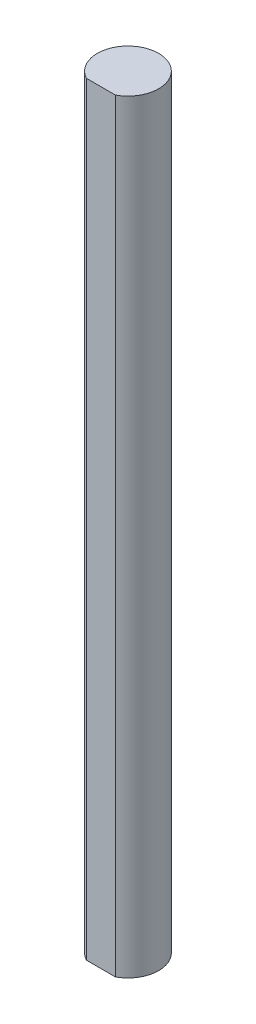
ISO-10303-21;
HEADER;
FILE_DESCRIPTION(('STEP AP214'),'2;1');
FILE_NAME('part.step','',(''),(''),'','','');
FILE_SCHEMA(('AUTOMOTIVE_DESIGN { 1 0 10303 214 1 1 1 1 }'));
ENDSEC;
DATA;
#1=APPLICATION_CONTEXT('core data for automotive mechanical design processes');
#2=APPLICATION_PROTOCOL_DEFINITION('international standard','automotive_design',2000,#1);
#3=PRODUCT_CONTEXT('',#1,'mechanical');
#4=PRODUCT('Part','Part','',(#3));
#5=PRODUCT_RELATED_PRODUCT_CATEGORY('part','',(#4));
#6=PRODUCT_DEFINITION_FORMATION('','',#4);
#7=PRODUCT_DEFINITION_CONTEXT('part definition',#1,'design');
#8=PRODUCT_DEFINITION('design','',#6,#7);
#9=PRODUCT_DEFINITION_SHAPE('','',#8);
#10=(LENGTH_UNIT() NAMED_UNIT(*) SI_UNIT(.MILLI.,.METRE.));
#11=(NAMED_UNIT(*) PLANE_ANGLE_UNIT() SI_UNIT($,.RADIAN.));
#12=(NAMED_UNIT(*) SI_UNIT($,.STERADIAN.) SOLID_ANGLE_UNIT());
#13=UNCERTAINTY_MEASURE_WITH_UNIT(LENGTH_MEASURE(1.E-05),#10,'distance_accuracy_value','');
#14=(GEOMETRIC_REPRESENTATION_CONTEXT(3) GLOBAL_UNCERTAINTY_ASSIGNED_CONTEXT((#13)) GLOBAL_UNIT_ASSIGNED_CONTEXT((#10,
#11,#12)) REPRESENTATION_CONTEXT('',''));
#15=CARTESIAN_POINT('',(0.,0.,0.));
#16=DIRECTION('',(0.,0.,1.));
#17=DIRECTION('',(1.,0.,0.));
#18=AXIS2_PLACEMENT_3D('',#15,#16,#17);
#19=CARTESIAN_POINT('',(0.,-79.,0.));
#20=DIRECTION('',(0.,1.,0.));
#21=DIRECTION('',(0.,0.,1.));
#22=AXIS2_PLACEMENT_3D('',#19,#20,#21);
#23=CYLINDRICAL_SURFACE('',#22,3.175);
#24=CARTESIAN_POINT('',(0.,0.,0.));
#25=DIRECTION('',(0.,1.,0.));
#26=DIRECTION('',(0.,0.,1.));
#27=AXIS2_PLACEMENT_3D('',#24,#25,#26);
#28=CIRCLE('',#27,3.175);
#29=CARTESIAN_POINT('',(1.5,0.,2.7983253920872));
#30=VERTEX_POINT('',#29);
#31=CARTESIAN_POINT('',(-1.5,0.,2.7983253920872));
#32=VERTEX_POINT('',#31);
#33=EDGE_CURVE('E61',#30,#32,#28,.T.);
#34=ORIENTED_EDGE('',*,*,#33,.F.);
#35=DIRECTION('',(0.,1.,0.));
#36=VECTOR('',#35,1.);
#37=CARTESIAN_POINT('',(1.5,-79.,2.7983253920872));
#38=LINE('',#37,#36);
#39=CARTESIAN_POINT('',(1.5,-79.,2.7983253920872));
#40=VERTEX_POINT('',#39);
#41=EDGE_CURVE('E11',#40,#30,#38,.T.);
#42=ORIENTED_EDGE('',*,*,#41,.F.);
#43=CARTESIAN_POINT('',(0.,-79.,0.));
#44=DIRECTION('',(0.,1.,0.));
#45=DIRECTION('',(0.,0.,1.));
#46=AXIS2_PLACEMENT_3D('',#43,#44,#45);
#47=CIRCLE('',#46,3.175);
#48=CARTESIAN_POINT('',(-1.5,-79.,2.7983253920872));
#49=VERTEX_POINT('',#48);
#50=EDGE_CURVE('E65',#40,#49,#47,.T.);
#51=ORIENTED_EDGE('',*,*,#50,.T.);
#52=DIRECTION('',(0.,1.,0.));
#53=VECTOR('',#52,1.);
#54=CARTESIAN_POINT('',(-1.5,-79.,2.7983253920872));
#55=LINE('',#54,#53);
#56=EDGE_CURVE('E35',#49,#32,#55,.T.);
#57=ORIENTED_EDGE('',*,*,#56,.T.);
#58=EDGE_LOOP('',(#34,#42,#51,#57));
#59=FACE_BOUND('',#58,.T.);
#60=ADVANCED_FACE('F32',(#59),#23,.T.);
#61=CARTESIAN_POINT('',(-1.5,-79.,2.7983253920872));
#62=DIRECTION('',(0.,0.,1.));
#63=DIRECTION('',(1.,0.,0.));
#64=AXIS2_PLACEMENT_3D('',#61,#62,#63);
#65=PLANE('',#64);
#66=DIRECTION('',(1.,0.,0.));
#67=VECTOR('',#66,1.);
#68=CARTESIAN_POINT('',(-1.5,0.,2.7983253920872));
#69=LINE('',#68,#67);
#70=EDGE_CURVE('E58',#32,#30,#69,.T.);
#71=ORIENTED_EDGE('',*,*,#70,.F.);
#72=ORIENTED_EDGE('',*,*,#56,.F.);
#73=DIRECTION('',(1.,0.,0.));
#74=VECTOR('',#73,1.);
#75=CARTESIAN_POINT('',(-1.5,-79.,2.7983253920872));
#76=LINE('',#75,#74);
#77=EDGE_CURVE('E60',#49,#40,#76,.T.);
#78=ORIENTED_EDGE('',*,*,#77,.T.);
#79=ORIENTED_EDGE('',*,*,#41,.T.);
#80=EDGE_LOOP('',(#71,#72,#78,#79));
#81=FACE_BOUND('',#80,.T.);
#82=ADVANCED_FACE('F56',(#81),#65,.T.);
#83=CARTESIAN_POINT('',(0.,-79.,0.));
#84=DIRECTION('',(0.,1.,0.));
#85=DIRECTION('',(0.,0.,1.));
#86=AXIS2_PLACEMENT_3D('',#83,#84,#85);
#87=PLANE('',#86);
#88=ORIENTED_EDGE('',*,*,#50,.F.);
#89=ORIENTED_EDGE('',*,*,#77,.F.);
#90=EDGE_LOOP('',(#88,#89));
#91=FACE_BOUND('',#90,.T.);
#92=ADVANCED_FACE('F70',(#91),#87,.F.);
#93=CARTESIAN_POINT('',(0.,0.,0.));
#94=DIRECTION('',(0.,1.,0.));
#95=DIRECTION('',(0.,0.,1.));
#96=AXIS2_PLACEMENT_3D('',#93,#94,#95);
#97=PLANE('',#96);
#98=ORIENTED_EDGE('',*,*,#33,.T.);
#99=ORIENTED_EDGE('',*,*,#70,.T.);
#100=EDGE_LOOP('',(#98,#99));
#101=FACE_BOUND('',#100,.T.);
#102=ADVANCED_FACE('F64',(#101),#97,.T.);
#103=CLOSED_SHELL('',(#60,#82,#92,#102));
#104=MANIFOLD_SOLID_BREP('B2',#103);
#105=ADVANCED_BREP_SHAPE_REPRESENTATION('',(#18,#104),#14);
#106=SHAPE_DEFINITION_REPRESENTATION(#9,#105);
ENDSEC;
END-ISO-10303-21;
